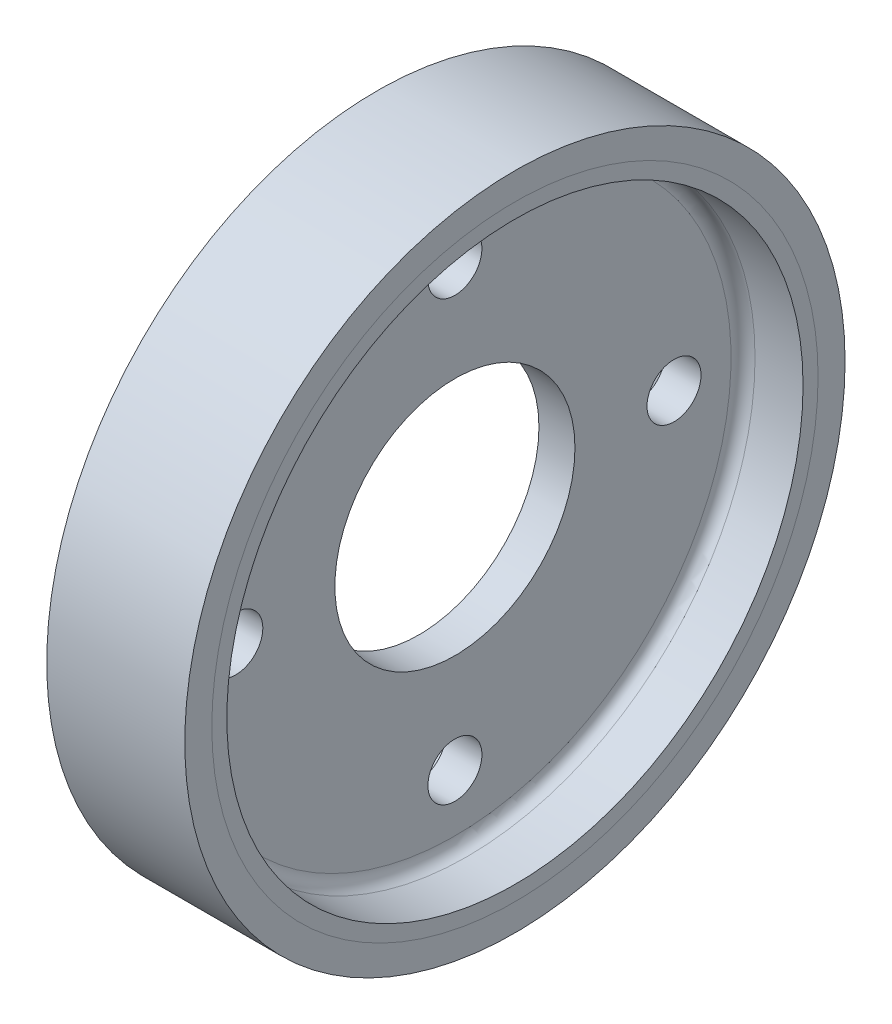
ISO-10303-21;
HEADER;
FILE_DESCRIPTION(('STEP AP214'),'2;1');
FILE_NAME('part.step','',(''),(''),'','','');
FILE_SCHEMA(('AUTOMOTIVE_DESIGN { 1 0 10303 214 1 1 1 1 }'));
ENDSEC;
DATA;
#1=APPLICATION_CONTEXT('core data for automotive mechanical design processes');
#2=APPLICATION_PROTOCOL_DEFINITION('international standard','automotive_design',2000,#1);
#3=PRODUCT_CONTEXT('',#1,'mechanical');
#4=PRODUCT('Part','Part','',(#3));
#5=PRODUCT_RELATED_PRODUCT_CATEGORY('part','',(#4));
#6=PRODUCT_DEFINITION_FORMATION('','',#4);
#7=PRODUCT_DEFINITION_CONTEXT('part definition',#1,'design');
#8=PRODUCT_DEFINITION('design','',#6,#7);
#9=PRODUCT_DEFINITION_SHAPE('','',#8);
#10=(LENGTH_UNIT() NAMED_UNIT(*) SI_UNIT(.MILLI.,.METRE.));
#11=(NAMED_UNIT(*) PLANE_ANGLE_UNIT() SI_UNIT($,.RADIAN.));
#12=(NAMED_UNIT(*) SI_UNIT($,.STERADIAN.) SOLID_ANGLE_UNIT());
#13=UNCERTAINTY_MEASURE_WITH_UNIT(LENGTH_MEASURE(1.E-05),#10,'distance_accuracy_value','');
#14=(GEOMETRIC_REPRESENTATION_CONTEXT(3) GLOBAL_UNCERTAINTY_ASSIGNED_CONTEXT((#13)) GLOBAL_UNIT_ASSIGNED_CONTEXT((#10,
#11,#12)) REPRESENTATION_CONTEXT('',''));
#15=CARTESIAN_POINT('',(0.,0.,0.));
#16=DIRECTION('',(0.,0.,1.));
#17=DIRECTION('',(1.,0.,0.));
#18=AXIS2_PLACEMENT_3D('',#15,#16,#17);
#19=CARTESIAN_POINT('',(-23.,50.5,0.));
#20=DIRECTION('',(-1.,0.,0.));
#21=DIRECTION('',(0.,0.,1.));
#22=AXIS2_PLACEMENT_3D('',#19,#20,#21);
#23=PLANE('',#22);
#24=CARTESIAN_POINT('',(-23.,0.,0.));
#25=DIRECTION('',(1.,0.,0.));
#26=DIRECTION('',(0.,0.,-1.));
#27=AXIS2_PLACEMENT_3D('',#24,#25,#26);
#28=CIRCLE('',#27,50.5);
#29=CARTESIAN_POINT('',(-23.,0.,-50.5));
#30=VERTEX_POINT('',#29);
#31=EDGE_CURVE('E74',#30,#30,#28,.T.);
#32=ORIENTED_EDGE('',*,*,#31,.T.);
#33=EDGE_LOOP('',(#32));
#34=FACE_BOUND('',#33,.T.);
#35=CARTESIAN_POINT('',(-23.,0.,0.));
#36=DIRECTION('',(1.,0.,0.));
#37=DIRECTION('',(0.,0.,-1.));
#38=AXIS2_PLACEMENT_3D('',#35,#36,#37);
#39=CIRCLE('',#38,55.);
#40=CARTESIAN_POINT('',(-23.,0.,-55.));
#41=VERTEX_POINT('',#40);
#42=EDGE_CURVE('E11',#41,#41,#39,.T.);
#43=ORIENTED_EDGE('',*,*,#42,.F.);
#44=EDGE_LOOP('',(#43));
#45=FACE_BOUND('',#44,.T.);
#46=ADVANCED_FACE('F55',(#34,#45),#23,.T.);
#47=CARTESIAN_POINT('',(0.,0.,0.));
#48=DIRECTION('',(1.,0.,0.));
#49=DIRECTION('',(0.,0.,-1.));
#50=AXIS2_PLACEMENT_3D('',#47,#48,#49);
#51=CYLINDRICAL_SURFACE('',#50,55.);
#52=ORIENTED_EDGE('',*,*,#42,.T.);
#53=EDGE_LOOP('',(#52));
#54=FACE_BOUND('',#53,.T.);
#55=CARTESIAN_POINT('',(0.,0.,0.));
#56=DIRECTION('',(1.,0.,0.));
#57=DIRECTION('',(0.,0.,-1.));
#58=AXIS2_PLACEMENT_3D('',#55,#56,#57);
#59=CIRCLE('',#58,55.);
#60=CARTESIAN_POINT('',(0.,0.,-55.));
#61=VERTEX_POINT('',#60);
#62=EDGE_CURVE('E62',#61,#61,#59,.T.);
#63=ORIENTED_EDGE('',*,*,#62,.F.);
#64=EDGE_LOOP('',(#63));
#65=FACE_BOUND('',#64,.T.);
#66=ADVANCED_FACE('F92',(#54,#65),#51,.T.);
#67=CARTESIAN_POINT('',(0.,50.5,0.));
#68=DIRECTION('',(1.,0.,0.));
#69=DIRECTION('',(0.,0.,-1.));
#70=AXIS2_PLACEMENT_3D('',#67,#68,#69);
#71=PLANE('',#70);
#72=ORIENTED_EDGE('',*,*,#62,.T.);
#73=EDGE_LOOP('',(#72));
#74=FACE_BOUND('',#73,.T.);
#75=CARTESIAN_POINT('',(0.,0.,0.));
#76=DIRECTION('',(1.,0.,0.));
#77=DIRECTION('',(0.,0.,-1.));
#78=AXIS2_PLACEMENT_3D('',#75,#76,#77);
#79=CIRCLE('',#78,50.5);
#80=CARTESIAN_POINT('',(0.,0.,-50.5));
#81=VERTEX_POINT('',#80);
#82=EDGE_CURVE('E68',#81,#81,#79,.T.);
#83=ORIENTED_EDGE('',*,*,#82,.F.);
#84=EDGE_LOOP('',(#83));
#85=FACE_BOUND('',#84,.T.);
#86=ADVANCED_FACE('F86',(#74,#85),#71,.T.);
#87=CARTESIAN_POINT('',(0.,0.,0.));
#88=DIRECTION('',(1.,0.,0.));
#89=DIRECTION('',(0.,0.,-1.));
#90=AXIS2_PLACEMENT_3D('',#87,#88,#89);
#91=CYLINDRICAL_SURFACE('',#90,50.5);
#92=ORIENTED_EDGE('',*,*,#82,.T.);
#93=EDGE_LOOP('',(#92));
#94=FACE_BOUND('',#93,.T.);
#95=ORIENTED_EDGE('',*,*,#31,.F.);
#96=EDGE_LOOP('',(#95));
#97=FACE_BOUND('',#96,.T.);
#98=ADVANCED_FACE('F84',(#94,#97),#91,.F.);
#99=CLOSED_SHELL('',(#46,#66,#86,#98));
#100=MANIFOLD_SOLID_BREP('B2',#99);
#101=CARTESIAN_POINT('',(0.,0.,0.));
#102=DIRECTION('',(1.,0.,0.));
#103=DIRECTION('',(0.,0.,-1.));
#104=AXIS2_PLACEMENT_3D('',#101,#102,#103);
#105=PLANE('',#104);
#106=CARTESIAN_POINT('',(0.,0.,0.));
#107=DIRECTION('',(1.,0.,0.));
#108=DIRECTION('',(0.,0.,-1.));
#109=AXIS2_PLACEMENT_3D('',#106,#107,#108);
#110=CIRCLE('',#109,48.);
#111=CARTESIAN_POINT('',(0.,0.,-48.));
#112=VERTEX_POINT('',#111);
#113=EDGE_CURVE('E160',#112,#112,#110,.T.);
#114=ORIENTED_EDGE('',*,*,#113,.F.);
#115=EDGE_LOOP('',(#114));
#116=FACE_BOUND('',#115,.T.);
#117=CARTESIAN_POINT('',(0.,0.,0.));
#118=DIRECTION('',(1.,0.,0.));
#119=DIRECTION('',(0.,0.,-1.));
#120=AXIS2_PLACEMENT_3D('',#117,#118,#119);
#121=CIRCLE('',#120,50.5);
#122=CARTESIAN_POINT('',(0.,0.,-50.5));
#123=VERTEX_POINT('',#122);
#124=EDGE_CURVE('E152',#123,#123,#121,.T.);
#125=ORIENTED_EDGE('',*,*,#124,.T.);
#126=EDGE_LOOP('',(#125));
#127=FACE_BOUND('',#126,.T.);
#128=ADVANCED_FACE('F125',(#116,#127),#105,.T.);
#129=CARTESIAN_POINT('',(0.,0.,0.));
#130=DIRECTION('',(1.,0.,0.));
#131=DIRECTION('',(0.,0.,-1.));
#132=AXIS2_PLACEMENT_3D('',#129,#130,#131);
#133=CYLINDRICAL_SURFACE('',#132,50.5);
#134=CARTESIAN_POINT('',(-23.,0.,0.));
#135=DIRECTION('',(1.,0.,0.));
#136=DIRECTION('',(0.,0.,-1.));
#137=AXIS2_PLACEMENT_3D('',#134,#135,#136);
#138=CIRCLE('',#137,50.5);
#139=CARTESIAN_POINT('',(-23.,0.,-50.5));
#140=VERTEX_POINT('',#139);
#141=EDGE_CURVE('E156',#140,#140,#138,.T.);
#142=ORIENTED_EDGE('',*,*,#141,.T.);
#143=EDGE_LOOP('',(#142));
#144=FACE_BOUND('',#143,.T.);
#145=ORIENTED_EDGE('',*,*,#124,.F.);
#146=EDGE_LOOP('',(#145));
#147=FACE_BOUND('',#146,.T.);
#148=ADVANCED_FACE('F247',(#144,#147),#133,.T.);
#149=CARTESIAN_POINT('',(-23.,0.,0.));
#150=DIRECTION('',(-1.,0.,0.));
#151=DIRECTION('',(0.,0.,1.));
#152=AXIS2_PLACEMENT_3D('',#149,#150,#151);
#153=PLANE('',#152);
#154=CARTESIAN_POINT('',(-23.,0.,0.));
#155=DIRECTION('',(-1.,0.,0.));
#156=DIRECTION('',(0.,0.,1.));
#157=AXIS2_PLACEMENT_3D('',#154,#155,#156);
#158=CIRCLE('',#157,45.);
#159=CARTESIAN_POINT('',(-23.,0.,45.));
#160=VERTEX_POINT('',#159);
#161=EDGE_CURVE('E134',#160,#160,#158,.F.);
#162=ORIENTED_EDGE('',*,*,#161,.T.);
#163=EDGE_LOOP('',(#162));
#164=FACE_BOUND('',#163,.T.);
#165=ORIENTED_EDGE('',*,*,#141,.F.);
#166=EDGE_LOOP('',(#165));
#167=FACE_BOUND('',#166,.T.);
#168=ADVANCED_FACE('F242',(#164,#167),#153,.T.);
#169=CARTESIAN_POINT('',(0.,0.,0.));
#170=DIRECTION('',(1.,0.,0.));
#171=DIRECTION('',(0.,0.,-1.));
#172=AXIS2_PLACEMENT_3D('',#169,#170,#171);
#173=CYLINDRICAL_SURFACE('',#172,48.);
#174=CARTESIAN_POINT('',(-8.00000000000001,0.,0.));
#175=DIRECTION('',(-1.,0.,0.));
#176=DIRECTION('',(0.,0.,1.));
#177=AXIS2_PLACEMENT_3D('',#174,#175,#176);
#178=CIRCLE('',#177,48.);
#179=CARTESIAN_POINT('',(-8.00000000000001,0.,48.));
#180=VERTEX_POINT('',#179);
#181=EDGE_CURVE('E140',#180,#180,#178,.T.);
#182=ORIENTED_EDGE('',*,*,#181,.T.);
#183=EDGE_LOOP('',(#182));
#184=FACE_BOUND('',#183,.T.);
#185=ORIENTED_EDGE('',*,*,#113,.T.);
#186=EDGE_LOOP('',(#185));
#187=FACE_BOUND('',#186,.T.);
#188=ADVANCED_FACE('F236',(#184,#187),#173,.F.);
#189=CARTESIAN_POINT('',(-10.,48.,0.));
#190=DIRECTION('',(-1.,0.,0.));
#191=DIRECTION('',(0.,0.,1.));
#192=AXIS2_PLACEMENT_3D('',#189,#190,#191);
#193=PLANE('',#192);
#194=CARTESIAN_POINT('',(-10.,0.,0.));
#195=DIRECTION('',(-1.,0.,0.));
#196=DIRECTION('',(0.,0.,1.));
#197=AXIS2_PLACEMENT_3D('',#194,#195,#196);
#198=CIRCLE('',#197,46.);
#199=CARTESIAN_POINT('',(-10.,0.,46.));
#200=VERTEX_POINT('',#199);
#201=EDGE_CURVE('E146',#200,#200,#198,.F.);
#202=ORIENTED_EDGE('',*,*,#201,.T.);
#203=EDGE_LOOP('',(#202));
#204=FACE_BOUND('',#203,.T.);
#205=CARTESIAN_POINT('',(-10.,-1.27439068867774E-13,36.5));
#206=DIRECTION('',(-1.,0.,0.));
#207=DIRECTION('',(0.,-1.,0.));
#208=AXIS2_PLACEMENT_3D('',#205,#206,#207);
#209=CIRCLE('',#208,4.49999999999999);
#210=CARTESIAN_POINT('',(-10.,-4.50000000000012,36.5));
#211=VERTEX_POINT('',#210);
#212=EDGE_CURVE('E184',#211,#211,#209,.T.);
#213=ORIENTED_EDGE('',*,*,#212,.T.);
#214=EDGE_LOOP('',(#213));
#215=FACE_BOUND('',#214,.T.);
#216=CARTESIAN_POINT('',(-10.,-36.5,0.));
#217=DIRECTION('',(-1.,0.,0.));
#218=DIRECTION('',(0.,0.,-1.));
#219=AXIS2_PLACEMENT_3D('',#216,#217,#218);
#220=CIRCLE('',#219,4.49999999999999);
#221=CARTESIAN_POINT('',(-10.,-36.5,-4.49999999999999));
#222=VERTEX_POINT('',#221);
#223=EDGE_CURVE('E194',#222,#222,#220,.T.);
#224=ORIENTED_EDGE('',*,*,#223,.T.);
#225=EDGE_LOOP('',(#224));
#226=FACE_BOUND('',#225,.T.);
#227=CARTESIAN_POINT('',(-10.,3.82317206603323E-13,-36.5));
#228=DIRECTION('',(-1.,0.,0.));
#229=DIRECTION('',(0.,1.,0.));
#230=AXIS2_PLACEMENT_3D('',#227,#228,#229);
#231=CIRCLE('',#230,4.49999999999999);
#232=CARTESIAN_POINT('',(-10.,4.50000000000038,-36.5));
#233=VERTEX_POINT('',#232);
#234=EDGE_CURVE('E185',#233,#233,#231,.T.);
#235=ORIENTED_EDGE('',*,*,#234,.T.);
#236=EDGE_LOOP('',(#235));
#237=FACE_BOUND('',#236,.T.);
#238=CARTESIAN_POINT('',(-10.,36.5,0.));
#239=DIRECTION('',(-1.,0.,0.));
#240=DIRECTION('',(0.,0.,1.));
#241=AXIS2_PLACEMENT_3D('',#238,#239,#240);
#242=CIRCLE('',#241,4.49999999999999);
#243=CARTESIAN_POINT('',(-10.,36.5,4.49999999999999));
#244=VERTEX_POINT('',#243);
#245=EDGE_CURVE('E176',#244,#244,#242,.T.);
#246=ORIENTED_EDGE('',*,*,#245,.T.);
#247=EDGE_LOOP('',(#246));
#248=FACE_BOUND('',#247,.T.);
#249=CARTESIAN_POINT('',(-10.,0.,0.));
#250=DIRECTION('',(1.,0.,0.));
#251=DIRECTION('',(0.,0.,-1.));
#252=AXIS2_PLACEMENT_3D('',#249,#250,#251);
#253=CIRCLE('',#252,20.);
#254=CARTESIAN_POINT('',(-10.,0.,-20.));
#255=VERTEX_POINT('',#254);
#256=EDGE_CURVE('E164',#255,#255,#253,.T.);
#257=ORIENTED_EDGE('',*,*,#256,.F.);
#258=EDGE_LOOP('',(#257));
#259=FACE_BOUND('',#258,.T.);
#260=ADVANCED_FACE('F231',(#204,#215,#226,#237,#248,#259),#193,.F.);
#261=CARTESIAN_POINT('',(0.,0.,0.));
#262=DIRECTION('',(1.,0.,0.));
#263=DIRECTION('',(0.,0.,-1.));
#264=AXIS2_PLACEMENT_3D('',#261,#262,#263);
#265=CYLINDRICAL_SURFACE('',#264,20.);
#266=CARTESIAN_POINT('',(-16.,0.,0.));
#267=DIRECTION('',(1.,0.,0.));
#268=DIRECTION('',(0.,0.,-1.));
#269=AXIS2_PLACEMENT_3D('',#266,#267,#268);
#270=CIRCLE('',#269,20.);
#271=CARTESIAN_POINT('',(-16.,0.,-20.));
#272=VERTEX_POINT('',#271);
#273=EDGE_CURVE('E168',#272,#272,#270,.T.);
#274=ORIENTED_EDGE('',*,*,#273,.F.);
#275=EDGE_LOOP('',(#274));
#276=FACE_BOUND('',#275,.T.);
#277=ORIENTED_EDGE('',*,*,#256,.T.);
#278=EDGE_LOOP('',(#277));
#279=FACE_BOUND('',#278,.T.);
#280=ADVANCED_FACE('F217',(#276,#279),#265,.F.);
#281=CARTESIAN_POINT('',(-16.,20.,0.));
#282=DIRECTION('',(1.,0.,0.));
#283=DIRECTION('',(0.,0.,-1.));
#284=AXIS2_PLACEMENT_3D('',#281,#282,#283);
#285=PLANE('',#284);
#286=CARTESIAN_POINT('',(-16.,-1.27439068867774E-13,36.5));
#287=DIRECTION('',(-1.,0.,0.));
#288=DIRECTION('',(0.,-1.,0.));
#289=AXIS2_PLACEMENT_3D('',#286,#287,#288);
#290=CIRCLE('',#289,4.49999999999999);
#291=CARTESIAN_POINT('',(-16.,-4.50000000000012,36.5));
#292=VERTEX_POINT('',#291);
#293=EDGE_CURVE('E198',#292,#292,#290,.T.);
#294=ORIENTED_EDGE('',*,*,#293,.F.);
#295=EDGE_LOOP('',(#294));
#296=FACE_BOUND('',#295,.T.);
#297=CARTESIAN_POINT('',(-16.,-36.5,0.));
#298=DIRECTION('',(-1.,0.,0.));
#299=DIRECTION('',(0.,0.,-1.));
#300=AXIS2_PLACEMENT_3D('',#297,#298,#299);
#301=CIRCLE('',#300,4.49999999999999);
#302=CARTESIAN_POINT('',(-16.,-36.5,-4.49999999999999));
#303=VERTEX_POINT('',#302);
#304=EDGE_CURVE('E189',#303,#303,#301,.T.);
#305=ORIENTED_EDGE('',*,*,#304,.F.);
#306=EDGE_LOOP('',(#305));
#307=FACE_BOUND('',#306,.T.);
#308=CARTESIAN_POINT('',(-16.,3.82317206603323E-13,-36.5));
#309=DIRECTION('',(-1.,0.,0.));
#310=DIRECTION('',(0.,1.,0.));
#311=AXIS2_PLACEMENT_3D('',#308,#309,#310);
#312=CIRCLE('',#311,4.49999999999999);
#313=CARTESIAN_POINT('',(-16.,4.50000000000037,-36.5));
#314=VERTEX_POINT('',#313);
#315=EDGE_CURVE('E190',#314,#314,#312,.T.);
#316=ORIENTED_EDGE('',*,*,#315,.F.);
#317=EDGE_LOOP('',(#316));
#318=FACE_BOUND('',#317,.T.);
#319=CARTESIAN_POINT('',(-16.,36.5,0.));
#320=DIRECTION('',(-1.,0.,0.));
#321=DIRECTION('',(0.,0.,1.));
#322=AXIS2_PLACEMENT_3D('',#319,#320,#321);
#323=CIRCLE('',#322,4.49999999999999);
#324=CARTESIAN_POINT('',(-16.,36.5,4.49999999999999));
#325=VERTEX_POINT('',#324);
#326=EDGE_CURVE('E180',#325,#325,#323,.T.);
#327=ORIENTED_EDGE('',*,*,#326,.F.);
#328=EDGE_LOOP('',(#327));
#329=FACE_BOUND('',#328,.T.);
#330=CARTESIAN_POINT('',(-16.,0.,0.));
#331=DIRECTION('',(1.,0.,0.));
#332=DIRECTION('',(0.,0.,-1.));
#333=AXIS2_PLACEMENT_3D('',#330,#331,#332);
#334=CIRCLE('',#333,44.);
#335=CARTESIAN_POINT('',(-16.,0.,-44.));
#336=VERTEX_POINT('',#335);
#337=EDGE_CURVE('E172',#336,#336,#334,.T.);
#338=ORIENTED_EDGE('',*,*,#337,.F.);
#339=EDGE_LOOP('',(#338));
#340=FACE_BOUND('',#339,.T.);
#341=ORIENTED_EDGE('',*,*,#273,.T.);
#342=EDGE_LOOP('',(#341));
#343=FACE_BOUND('',#342,.T.);
#344=ADVANCED_FACE('F213',(#296,#307,#318,#329,#340,#343),#285,.F.);
#345=CARTESIAN_POINT('',(0.,0.,0.));
#346=DIRECTION('',(1.,0.,0.));
#347=DIRECTION('',(0.,0.,-1.));
#348=AXIS2_PLACEMENT_3D('',#345,#346,#347);
#349=CYLINDRICAL_SURFACE('',#348,44.);
#350=CARTESIAN_POINT('',(-22.,0.,0.));
#351=DIRECTION('',(-1.,0.,0.));
#352=DIRECTION('',(0.,0.,1.));
#353=AXIS2_PLACEMENT_3D('',#350,#351,#352);
#354=CIRCLE('',#353,44.);
#355=CARTESIAN_POINT('',(-22.,0.,44.));
#356=VERTEX_POINT('',#355);
#357=EDGE_CURVE('E54',#356,#356,#354,.T.);
#358=ORIENTED_EDGE('',*,*,#357,.T.);
#359=EDGE_LOOP('',(#358));
#360=FACE_BOUND('',#359,.T.);
#361=ORIENTED_EDGE('',*,*,#337,.T.);
#362=EDGE_LOOP('',(#361));
#363=FACE_BOUND('',#362,.T.);
#364=ADVANCED_FACE('F216',(#360,#363),#349,.F.);
#365=CARTESIAN_POINT('',(-16.,36.5,0.));
#366=DIRECTION('',(-1.,0.,0.));
#367=DIRECTION('',(0.,0.,1.));
#368=AXIS2_PLACEMENT_3D('',#365,#366,#367);
#369=CYLINDRICAL_SURFACE('',#368,4.49999999999999);
#370=ORIENTED_EDGE('',*,*,#326,.T.);
#371=EDGE_LOOP('',(#370));
#372=FACE_BOUND('',#371,.T.);
#373=ORIENTED_EDGE('',*,*,#245,.F.);
#374=EDGE_LOOP('',(#373));
#375=FACE_BOUND('',#374,.T.);
#376=ADVANCED_FACE('F281',(#372,#375),#369,.F.);
#377=CARTESIAN_POINT('',(-16.,3.82317206603323E-13,-36.5));
#378=DIRECTION('',(-1.,0.,0.));
#379=DIRECTION('',(0.,1.,0.));
#380=AXIS2_PLACEMENT_3D('',#377,#378,#379);
#381=CYLINDRICAL_SURFACE('',#380,4.49999999999999);
#382=ORIENTED_EDGE('',*,*,#315,.T.);
#383=EDGE_LOOP('',(#382));
#384=FACE_BOUND('',#383,.T.);
#385=ORIENTED_EDGE('',*,*,#234,.F.);
#386=EDGE_LOOP('',(#385));
#387=FACE_BOUND('',#386,.T.);
#388=ADVANCED_FACE('F275',(#384,#387),#381,.F.);
#389=CARTESIAN_POINT('',(-16.,-36.5,0.));
#390=DIRECTION('',(-1.,0.,0.));
#391=DIRECTION('',(0.,0.,-1.));
#392=AXIS2_PLACEMENT_3D('',#389,#390,#391);
#393=CYLINDRICAL_SURFACE('',#392,4.49999999999999);
#394=ORIENTED_EDGE('',*,*,#304,.T.);
#395=EDGE_LOOP('',(#394));
#396=FACE_BOUND('',#395,.T.);
#397=ORIENTED_EDGE('',*,*,#223,.F.);
#398=EDGE_LOOP('',(#397));
#399=FACE_BOUND('',#398,.T.);
#400=ADVANCED_FACE('F266',(#396,#399),#393,.F.);
#401=CARTESIAN_POINT('',(-16.,-1.27439068867774E-13,36.5));
#402=DIRECTION('',(-1.,0.,0.));
#403=DIRECTION('',(0.,-1.,0.));
#404=AXIS2_PLACEMENT_3D('',#401,#402,#403);
#405=CYLINDRICAL_SURFACE('',#404,4.49999999999999);
#406=ORIENTED_EDGE('',*,*,#293,.T.);
#407=EDGE_LOOP('',(#406));
#408=FACE_BOUND('',#407,.T.);
#409=ORIENTED_EDGE('',*,*,#212,.F.);
#410=EDGE_LOOP('',(#409));
#411=FACE_BOUND('',#410,.T.);
#412=ADVANCED_FACE('F210',(#408,#411),#405,.F.);
#413=CARTESIAN_POINT('',(-8.00000000000001,0.,0.));
#414=DIRECTION('',(-1.,0.,0.));
#415=DIRECTION('',(0.,0.,1.));
#416=AXIS2_PLACEMENT_3D('',#413,#414,#415);
#417=TOROIDAL_SURFACE('',#416,46.,2.);
#418=ORIENTED_EDGE('',*,*,#181,.F.);
#419=EDGE_LOOP('',(#418));
#420=FACE_BOUND('',#419,.T.);
#421=ORIENTED_EDGE('',*,*,#201,.F.);
#422=EDGE_LOOP('',(#421));
#423=FACE_BOUND('',#422,.T.);
#424=ADVANCED_FACE('F258',(#420,#423),#417,.F.);
#425=CARTESIAN_POINT('',(-23.,0.,0.));
#426=DIRECTION('',(-1.,0.,0.));
#427=DIRECTION('',(0.,0.,1.));
#428=AXIS2_PLACEMENT_3D('',#425,#426,#427);
#429=CONICAL_SURFACE('',#428,45.,0.785398163397445);
#430=ORIENTED_EDGE('',*,*,#357,.F.);
#431=EDGE_LOOP('',(#430));
#432=FACE_BOUND('',#431,.T.);
#433=ORIENTED_EDGE('',*,*,#161,.F.);
#434=EDGE_LOOP('',(#433));
#435=FACE_BOUND('',#434,.T.);
#436=ADVANCED_FACE('F128',(#432,#435),#429,.F.);
#437=CLOSED_SHELL('',(#128,#148,#168,#188,#260,#280,#344,#364,#376,#388,#400,#412,#424,#436));
#438=MANIFOLD_SOLID_BREP('B6',#437);
#439=ADVANCED_BREP_SHAPE_REPRESENTATION('',(#18,#100,#438),#14);
#440=SHAPE_DEFINITION_REPRESENTATION(#9,#439);
ENDSEC;
END-ISO-10303-21;
